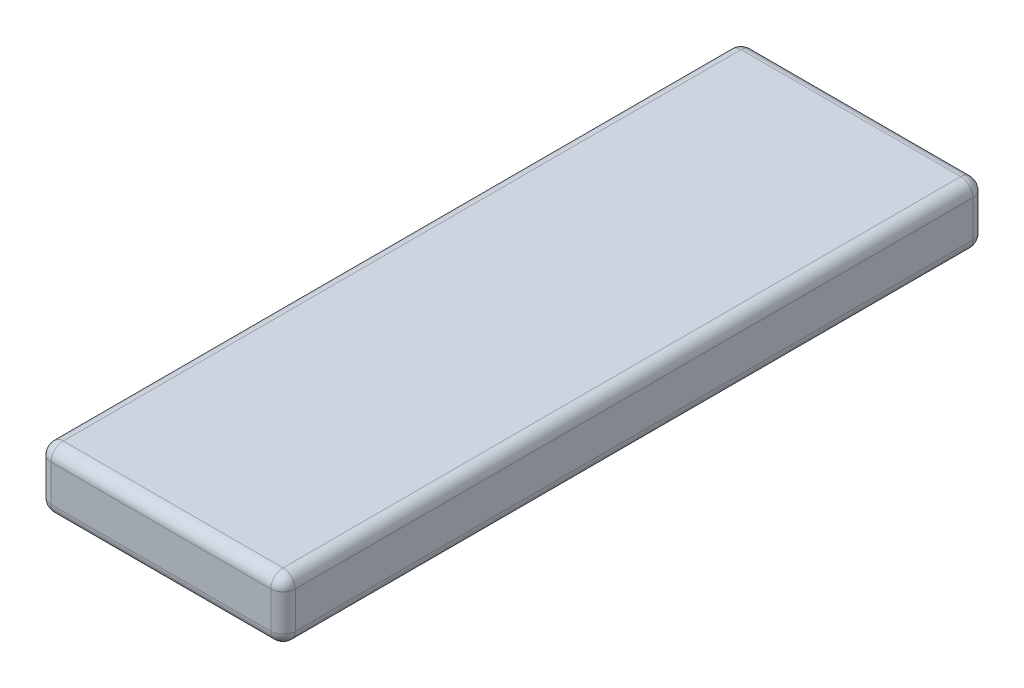
ISO-10303-21;
HEADER;
FILE_DESCRIPTION(('STEP AP214'),'2;1');
FILE_NAME('part.step','',(''),(''),'','','');
FILE_SCHEMA(('AUTOMOTIVE_DESIGN { 1 0 10303 214 1 1 1 1 }'));
ENDSEC;
DATA;
#1=APPLICATION_CONTEXT('core data for automotive mechanical design processes');
#2=APPLICATION_PROTOCOL_DEFINITION('international standard','automotive_design',2000,#1);
#3=PRODUCT_CONTEXT('',#1,'mechanical');
#4=PRODUCT('Part','Part','',(#3));
#5=PRODUCT_RELATED_PRODUCT_CATEGORY('part','',(#4));
#6=PRODUCT_DEFINITION_FORMATION('','',#4);
#7=PRODUCT_DEFINITION_CONTEXT('part definition',#1,'design');
#8=PRODUCT_DEFINITION('design','',#6,#7);
#9=PRODUCT_DEFINITION_SHAPE('','',#8);
#10=(LENGTH_UNIT() NAMED_UNIT(*) SI_UNIT(.MILLI.,.METRE.));
#11=(NAMED_UNIT(*) PLANE_ANGLE_UNIT() SI_UNIT($,.RADIAN.));
#12=(NAMED_UNIT(*) SI_UNIT($,.STERADIAN.) SOLID_ANGLE_UNIT());
#13=UNCERTAINTY_MEASURE_WITH_UNIT(LENGTH_MEASURE(1.E-05),#10,'distance_accuracy_value','');
#14=(GEOMETRIC_REPRESENTATION_CONTEXT(3) GLOBAL_UNCERTAINTY_ASSIGNED_CONTEXT((#13)) GLOBAL_UNIT_ASSIGNED_CONTEXT((#10,
#11,#12)) REPRESENTATION_CONTEXT('',''));
#15=CARTESIAN_POINT('',(0.,0.,0.));
#16=DIRECTION('',(0.,0.,1.));
#17=DIRECTION('',(1.,0.,0.));
#18=AXIS2_PLACEMENT_3D('',#15,#16,#17);
#19=CARTESIAN_POINT('',(1.8,0.199999999999996,11.3));
#20=DIRECTION('',(0.,0.258819045103027,0.965925826288933));
#21=DIRECTION('',(0.,-0.965925826288933,0.258819045103027));
#22=AXIS2_PLACEMENT_3D('',#19,#20,#21);
#23=SPHERICAL_SURFACE('',#22,0.199999999999998);
#24=CARTESIAN_POINT('',(1.8,0.2,11.3));
#25=DIRECTION('',(-1.,0.,0.));
#26=DIRECTION('',(0.,0.,1.));
#27=AXIS2_PLACEMENT_3D('',#24,#25,#26);
#28=CIRCLE('',#27,0.200000000000001);
#29=CARTESIAN_POINT('',(1.8,0.,11.3));
#30=VERTEX_POINT('',#29);
#31=CARTESIAN_POINT('',(1.8,0.2,11.5));
#32=VERTEX_POINT('',#31);
#33=EDGE_CURVE('E128',#30,#32,#28,.T.);
#34=ORIENTED_EDGE('',*,*,#33,.F.);
#35=CARTESIAN_POINT('',(1.8,0.2,11.3));
#36=DIRECTION('',(0.,0.,1.));
#37=DIRECTION('',(1.,0.,0.));
#38=AXIS2_PLACEMENT_3D('',#35,#36,#37);
#39=CIRCLE('',#38,0.2);
#40=CARTESIAN_POINT('',(2.,0.2,11.3));
#41=VERTEX_POINT('',#40);
#42=EDGE_CURVE('E21',#41,#30,#39,.F.);
#43=ORIENTED_EDGE('',*,*,#42,.F.);
#44=CARTESIAN_POINT('',(1.8,0.2,11.3));
#45=DIRECTION('',(0.,1.,0.));
#46=DIRECTION('',(0.,0.,1.));
#47=AXIS2_PLACEMENT_3D('',#44,#45,#46);
#48=CIRCLE('',#47,0.200000000000001);
#49=EDGE_CURVE('E103',#32,#41,#48,.T.);
#50=ORIENTED_EDGE('',*,*,#49,.F.);
#51=EDGE_LOOP('',(#34,#43,#50));
#52=FACE_BOUND('',#51,.T.);
#53=ADVANCED_FACE('F17',(#52),#23,.T.);
#54=CARTESIAN_POINT('',(-1.8,0.199999999999993,11.3));
#55=DIRECTION('',(0.,-0.96592582628894,-0.258819045102999));
#56=DIRECTION('',(0.,-0.258819045102999,0.96592582628894));
#57=AXIS2_PLACEMENT_3D('',#54,#55,#56);
#58=SPHERICAL_SURFACE('',#57,0.199999999999996);
#59=CARTESIAN_POINT('',(-1.8,0.2,11.3));
#60=DIRECTION('',(-1.,0.,0.));
#61=DIRECTION('',(0.,0.,1.));
#62=AXIS2_PLACEMENT_3D('',#59,#60,#61);
#63=CIRCLE('',#62,0.200000000000001);
#64=CARTESIAN_POINT('',(-1.8,0.2,11.5));
#65=VERTEX_POINT('',#64);
#66=CARTESIAN_POINT('',(-1.8,0.,11.3));
#67=VERTEX_POINT('',#66);
#68=EDGE_CURVE('E152',#65,#67,#63,.F.);
#69=ORIENTED_EDGE('',*,*,#68,.F.);
#70=CARTESIAN_POINT('',(-1.8,0.2,11.3));
#71=DIRECTION('',(0.,-1.,0.));
#72=DIRECTION('',(0.,0.,-1.));
#73=AXIS2_PLACEMENT_3D('',#70,#71,#72);
#74=CIRCLE('',#73,0.200000000000001);
#75=CARTESIAN_POINT('',(-2.,0.2,11.3));
#76=VERTEX_POINT('',#75);
#77=EDGE_CURVE('E114',#76,#65,#74,.F.);
#78=ORIENTED_EDGE('',*,*,#77,.F.);
#79=CARTESIAN_POINT('',(-1.8,0.2,11.3));
#80=DIRECTION('',(0.,0.,1.));
#81=DIRECTION('',(1.,0.,0.));
#82=AXIS2_PLACEMENT_3D('',#79,#80,#81);
#83=CIRCLE('',#82,0.2);
#84=EDGE_CURVE('E149',#67,#76,#83,.F.);
#85=ORIENTED_EDGE('',*,*,#84,.F.);
#86=EDGE_LOOP('',(#69,#78,#85));
#87=FACE_BOUND('',#86,.T.);
#88=ADVANCED_FACE('F334',(#87),#58,.T.);
#89=CARTESIAN_POINT('',(2.,0.,0.));
#90=DIRECTION('',(0.,1.,0.));
#91=DIRECTION('',(0.,0.,1.));
#92=AXIS2_PLACEMENT_3D('',#89,#90,#91);
#93=PLANE('',#92);
#94=DIRECTION('',(0.,0.,1.));
#95=VECTOR('',#94,1.);
#96=CARTESIAN_POINT('',(1.8,0.,5.75));
#97=LINE('',#96,#95);
#98=CARTESIAN_POINT('',(1.8,0.,0.2));
#99=VERTEX_POINT('',#98);
#100=EDGE_CURVE('E131',#30,#99,#97,.F.);
#101=ORIENTED_EDGE('',*,*,#100,.F.);
#102=DIRECTION('',(-1.,0.,0.));
#103=VECTOR('',#102,1.);
#104=CARTESIAN_POINT('',(0.,0.,11.3));
#105=LINE('',#104,#103);
#106=EDGE_CURVE('E115',#67,#30,#105,.F.);
#107=ORIENTED_EDGE('',*,*,#106,.F.);
#108=DIRECTION('',(0.,0.,1.));
#109=VECTOR('',#108,1.);
#110=CARTESIAN_POINT('',(-1.8,0.,5.75));
#111=LINE('',#110,#109);
#112=CARTESIAN_POINT('',(-1.8,0.,0.2));
#113=VERTEX_POINT('',#112);
#114=EDGE_CURVE('E146',#113,#67,#111,.T.);
#115=ORIENTED_EDGE('',*,*,#114,.F.);
#116=DIRECTION('',(-1.,0.,0.));
#117=VECTOR('',#116,1.);
#118=CARTESIAN_POINT('',(0.,0.,0.2));
#119=LINE('',#118,#117);
#120=EDGE_CURVE('E141',#99,#113,#119,.T.);
#121=ORIENTED_EDGE('',*,*,#120,.F.);
#122=EDGE_LOOP('',(#101,#107,#115,#121));
#123=FACE_BOUND('',#122,.T.);
#124=ADVANCED_FACE('F333',(#123),#93,.F.);
#125=CARTESIAN_POINT('',(-1.8,0.2,0.200000000000001));
#126=DIRECTION('',(-0.965925826288943,0.,0.258819045102987));
#127=DIRECTION('',(-0.258819045102987,0.,-0.965925826288943));
#128=AXIS2_PLACEMENT_3D('',#125,#126,#127);
#129=SPHERICAL_SURFACE('',#128,0.2);
#130=CARTESIAN_POINT('',(-1.8,0.2,0.2));
#131=DIRECTION('',(-1.,0.,0.));
#132=DIRECTION('',(0.,0.,1.));
#133=AXIS2_PLACEMENT_3D('',#130,#131,#132);
#134=CIRCLE('',#133,0.2);
#135=CARTESIAN_POINT('',(-1.8,0.2,0.));
#136=VERTEX_POINT('',#135);
#137=EDGE_CURVE('E144',#113,#136,#134,.F.);
#138=ORIENTED_EDGE('',*,*,#137,.F.);
#139=CARTESIAN_POINT('',(-1.8,0.2,0.2));
#140=DIRECTION('',(0.,0.,1.));
#141=DIRECTION('',(1.,0.,0.));
#142=AXIS2_PLACEMENT_3D('',#139,#140,#141);
#143=CIRCLE('',#142,0.2);
#144=CARTESIAN_POINT('',(-2.,0.2,0.2));
#145=VERTEX_POINT('',#144);
#146=EDGE_CURVE('E150',#145,#113,#143,.T.);
#147=ORIENTED_EDGE('',*,*,#146,.F.);
#148=CARTESIAN_POINT('',(-1.8,0.2,0.2));
#149=DIRECTION('',(0.,-1.,0.));
#150=DIRECTION('',(0.,0.,-1.));
#151=AXIS2_PLACEMENT_3D('',#148,#149,#150);
#152=CIRCLE('',#151,0.2);
#153=EDGE_CURVE('E181',#136,#145,#152,.F.);
#154=ORIENTED_EDGE('',*,*,#153,.F.);
#155=EDGE_LOOP('',(#138,#147,#154));
#156=FACE_BOUND('',#155,.T.);
#157=ADVANCED_FACE('F228',(#156),#129,.T.);
#158=CARTESIAN_POINT('',(1.8,0.2,0.200000000000001));
#159=DIRECTION('',(-0.258819045102989,0.,-0.965925826288943));
#160=DIRECTION('',(0.965925826288943,0.,-0.258819045102989));
#161=AXIS2_PLACEMENT_3D('',#158,#159,#160);
#162=SPHERICAL_SURFACE('',#161,0.2);
#163=CARTESIAN_POINT('',(1.8,0.2,0.2));
#164=DIRECTION('',(0.,0.,1.));
#165=DIRECTION('',(1.,0.,0.));
#166=AXIS2_PLACEMENT_3D('',#163,#164,#165);
#167=CIRCLE('',#166,0.2);
#168=CARTESIAN_POINT('',(2.,0.2,0.2));
#169=VERTEX_POINT('',#168);
#170=EDGE_CURVE('E134',#99,#169,#167,.T.);
#171=ORIENTED_EDGE('',*,*,#170,.F.);
#172=CARTESIAN_POINT('',(1.8,0.2,0.2));
#173=DIRECTION('',(-1.,0.,0.));
#174=DIRECTION('',(0.,0.,1.));
#175=AXIS2_PLACEMENT_3D('',#172,#173,#174);
#176=CIRCLE('',#175,0.2);
#177=CARTESIAN_POINT('',(1.8,0.2,0.));
#178=VERTEX_POINT('',#177);
#179=EDGE_CURVE('E145',#178,#99,#176,.T.);
#180=ORIENTED_EDGE('',*,*,#179,.F.);
#181=CARTESIAN_POINT('',(1.8,0.2,0.2));
#182=DIRECTION('',(0.,1.,0.));
#183=DIRECTION('',(0.,0.,1.));
#184=AXIS2_PLACEMENT_3D('',#181,#182,#183);
#185=CIRCLE('',#184,0.2);
#186=EDGE_CURVE('E125',#169,#178,#185,.T.);
#187=ORIENTED_EDGE('',*,*,#186,.F.);
#188=EDGE_LOOP('',(#171,#180,#187));
#189=FACE_BOUND('',#188,.T.);
#190=ADVANCED_FACE('F327',(#189),#162,.T.);
#191=CARTESIAN_POINT('',(1.8,0.2,5.75));
#192=DIRECTION('',(0.,0.,1.));
#193=DIRECTION('',(1.,0.,0.));
#194=AXIS2_PLACEMENT_3D('',#191,#192,#193);
#195=CYLINDRICAL_SURFACE('',#194,0.2);
#196=ORIENTED_EDGE('',*,*,#170,.T.);
#197=DIRECTION('',(0.,0.,-1.));
#198=VECTOR('',#197,1.);
#199=CARTESIAN_POINT('',(2.,0.2,0.));
#200=LINE('',#199,#198);
#201=EDGE_CURVE('E121',#41,#169,#200,.T.);
#202=ORIENTED_EDGE('',*,*,#201,.F.);
#203=ORIENTED_EDGE('',*,*,#42,.T.);
#204=ORIENTED_EDGE('',*,*,#100,.T.);
#205=EDGE_LOOP('',(#196,#202,#203,#204));
#206=FACE_BOUND('',#205,.T.);
#207=ADVANCED_FACE('F132',(#206),#195,.T.);
#208=CARTESIAN_POINT('',(0.,0.2,11.3));
#209=DIRECTION('',(-1.,0.,0.));
#210=DIRECTION('',(0.,0.,1.));
#211=AXIS2_PLACEMENT_3D('',#208,#209,#210);
#212=CYLINDRICAL_SURFACE('',#211,0.200000000000001);
#213=ORIENTED_EDGE('',*,*,#68,.T.);
#214=ORIENTED_EDGE('',*,*,#106,.T.);
#215=ORIENTED_EDGE('',*,*,#33,.T.);
#216=DIRECTION('',(1.,0.,0.));
#217=VECTOR('',#216,1.);
#218=CARTESIAN_POINT('',(0.,0.2,11.5));
#219=LINE('',#218,#217);
#220=EDGE_CURVE('E177',#65,#32,#219,.T.);
#221=ORIENTED_EDGE('',*,*,#220,.F.);
#222=EDGE_LOOP('',(#213,#214,#215,#221));
#223=FACE_BOUND('',#222,.T.);
#224=ADVANCED_FACE('F345',(#223),#212,.T.);
#225=CARTESIAN_POINT('',(1.8,0.5,11.3));
#226=DIRECTION('',(0.,1.,0.));
#227=DIRECTION('',(0.,0.,1.));
#228=AXIS2_PLACEMENT_3D('',#225,#226,#227);
#229=CYLINDRICAL_SURFACE('',#228,0.200000000000001);
#230=ORIENTED_EDGE('',*,*,#49,.T.);
#231=DIRECTION('',(0.,1.,0.));
#232=VECTOR('',#231,1.);
#233=CARTESIAN_POINT('',(2.,0.,11.3));
#234=LINE('',#233,#232);
#235=CARTESIAN_POINT('',(2.,0.8,11.3));
#236=VERTEX_POINT('',#235);
#237=EDGE_CURVE('E107',#236,#41,#234,.F.);
#238=ORIENTED_EDGE('',*,*,#237,.F.);
#239=CARTESIAN_POINT('',(1.8,0.8,11.3));
#240=DIRECTION('',(0.,1.,0.));
#241=DIRECTION('',(0.,0.,1.));
#242=AXIS2_PLACEMENT_3D('',#239,#240,#241);
#243=CIRCLE('',#242,0.200000000000001);
#244=CARTESIAN_POINT('',(1.8,0.8,11.5));
#245=VERTEX_POINT('',#244);
#246=EDGE_CURVE('E175',#245,#236,#243,.T.);
#247=ORIENTED_EDGE('',*,*,#246,.F.);
#248=DIRECTION('',(0.,1.,0.));
#249=VECTOR('',#248,1.);
#250=CARTESIAN_POINT('',(1.8,0.,11.5));
#251=LINE('',#250,#249);
#252=EDGE_CURVE('E109',#32,#245,#251,.T.);
#253=ORIENTED_EDGE('',*,*,#252,.F.);
#254=EDGE_LOOP('',(#230,#238,#247,#253));
#255=FACE_BOUND('',#254,.T.);
#256=ADVANCED_FACE('F105',(#255),#229,.T.);
#257=CARTESIAN_POINT('',(-1.8,0.5,11.3));
#258=DIRECTION('',(0.,-1.,0.));
#259=DIRECTION('',(0.,0.,-1.));
#260=AXIS2_PLACEMENT_3D('',#257,#258,#259);
#261=CYLINDRICAL_SURFACE('',#260,0.200000000000001);
#262=CARTESIAN_POINT('',(-1.8,0.8,11.3));
#263=DIRECTION('',(0.,-1.,0.));
#264=DIRECTION('',(0.,0.,-1.));
#265=AXIS2_PLACEMENT_3D('',#262,#263,#264);
#266=CIRCLE('',#265,0.200000000000001);
#267=CARTESIAN_POINT('',(-2.,0.8,11.3));
#268=VERTEX_POINT('',#267);
#269=CARTESIAN_POINT('',(-1.8,0.8,11.5));
#270=VERTEX_POINT('',#269);
#271=EDGE_CURVE('E172',#268,#270,#266,.F.);
#272=ORIENTED_EDGE('',*,*,#271,.F.);
#273=DIRECTION('',(0.,1.,0.));
#274=VECTOR('',#273,1.);
#275=CARTESIAN_POINT('',(-2.,1.,11.3));
#276=LINE('',#275,#274);
#277=EDGE_CURVE('E174',#76,#268,#276,.T.);
#278=ORIENTED_EDGE('',*,*,#277,.F.);
#279=ORIENTED_EDGE('',*,*,#77,.T.);
#280=DIRECTION('',(0.,1.,0.));
#281=VECTOR('',#280,1.);
#282=CARTESIAN_POINT('',(-1.8,0.,11.5));
#283=LINE('',#282,#281);
#284=EDGE_CURVE('E192',#270,#65,#283,.F.);
#285=ORIENTED_EDGE('',*,*,#284,.F.);
#286=EDGE_LOOP('',(#272,#278,#279,#285));
#287=FACE_BOUND('',#286,.T.);
#288=ADVANCED_FACE('F292',(#287),#261,.T.);
#289=CARTESIAN_POINT('',(-1.8,0.2,5.75));
#290=DIRECTION('',(0.,0.,1.));
#291=DIRECTION('',(1.,0.,0.));
#292=AXIS2_PLACEMENT_3D('',#289,#290,#291);
#293=CYLINDRICAL_SURFACE('',#292,0.2);
#294=ORIENTED_EDGE('',*,*,#84,.T.);
#295=DIRECTION('',(0.,0.,1.));
#296=VECTOR('',#295,1.);
#297=CARTESIAN_POINT('',(-2.,0.2,0.));
#298=LINE('',#297,#296);
#299=EDGE_CURVE('E190',#145,#76,#298,.T.);
#300=ORIENTED_EDGE('',*,*,#299,.F.);
#301=ORIENTED_EDGE('',*,*,#146,.T.);
#302=ORIENTED_EDGE('',*,*,#114,.T.);
#303=EDGE_LOOP('',(#294,#300,#301,#302));
#304=FACE_BOUND('',#303,.T.);
#305=ADVANCED_FACE('F230',(#304),#293,.T.);
#306=CARTESIAN_POINT('',(-1.8,0.5,0.2));
#307=DIRECTION('',(0.,-1.,0.));
#308=DIRECTION('',(0.,0.,-1.));
#309=AXIS2_PLACEMENT_3D('',#306,#307,#308);
#310=CYLINDRICAL_SURFACE('',#309,0.2);
#311=CARTESIAN_POINT('',(-1.8,0.8,0.200000000000001));
#312=DIRECTION('',(0.,1.,0.));
#313=DIRECTION('',(0.,0.,1.));
#314=AXIS2_PLACEMENT_3D('',#311,#312,#313);
#315=CIRCLE('',#314,0.2);
#316=CARTESIAN_POINT('',(-1.8,0.8,0.));
#317=VERTEX_POINT('',#316);
#318=CARTESIAN_POINT('',(-2.,0.8,0.2));
#319=VERTEX_POINT('',#318);
#320=EDGE_CURVE('E232',#317,#319,#315,.T.);
#321=ORIENTED_EDGE('',*,*,#320,.F.);
#322=DIRECTION('',(0.,1.,0.));
#323=VECTOR('',#322,1.);
#324=CARTESIAN_POINT('',(-1.8,0.,0.));
#325=LINE('',#324,#323);
#326=EDGE_CURVE('E206',#317,#136,#325,.F.);
#327=ORIENTED_EDGE('',*,*,#326,.T.);
#328=ORIENTED_EDGE('',*,*,#153,.T.);
#329=DIRECTION('',(0.,1.,0.));
#330=VECTOR('',#329,1.);
#331=CARTESIAN_POINT('',(-2.,1.,0.2));
#332=LINE('',#331,#330);
#333=EDGE_CURVE('E214',#319,#145,#332,.F.);
#334=ORIENTED_EDGE('',*,*,#333,.F.);
#335=EDGE_LOOP('',(#321,#327,#328,#334));
#336=FACE_BOUND('',#335,.T.);
#337=ADVANCED_FACE('F213',(#336),#310,.T.);
#338=CARTESIAN_POINT('',(0.,0.2,0.2));
#339=DIRECTION('',(-1.,0.,0.));
#340=DIRECTION('',(0.,0.,1.));
#341=AXIS2_PLACEMENT_3D('',#338,#339,#340);
#342=CYLINDRICAL_SURFACE('',#341,0.2);
#343=ORIENTED_EDGE('',*,*,#137,.T.);
#344=DIRECTION('',(1.,0.,0.));
#345=VECTOR('',#344,1.);
#346=CARTESIAN_POINT('',(0.,0.2,0.));
#347=LINE('',#346,#345);
#348=EDGE_CURVE('E204',#136,#178,#347,.T.);
#349=ORIENTED_EDGE('',*,*,#348,.T.);
#350=ORIENTED_EDGE('',*,*,#179,.T.);
#351=ORIENTED_EDGE('',*,*,#120,.T.);
#352=EDGE_LOOP('',(#343,#349,#350,#351));
#353=FACE_BOUND('',#352,.T.);
#354=ADVANCED_FACE('F356',(#353),#342,.T.);
#355=CARTESIAN_POINT('',(1.8,0.5,0.2));
#356=DIRECTION('',(0.,1.,0.));
#357=DIRECTION('',(0.,0.,1.));
#358=AXIS2_PLACEMENT_3D('',#355,#356,#357);
#359=CYLINDRICAL_SURFACE('',#358,0.2);
#360=ORIENTED_EDGE('',*,*,#186,.T.);
#361=DIRECTION('',(0.,1.,0.));
#362=VECTOR('',#361,1.);
#363=CARTESIAN_POINT('',(1.8,0.,0.));
#364=LINE('',#363,#362);
#365=CARTESIAN_POINT('',(1.8,0.8,0.));
#366=VERTEX_POINT('',#365);
#367=EDGE_CURVE('E171',#178,#366,#364,.T.);
#368=ORIENTED_EDGE('',*,*,#367,.T.);
#369=CARTESIAN_POINT('',(1.8,0.8,0.200000000000001));
#370=DIRECTION('',(0.,1.,0.));
#371=DIRECTION('',(0.,0.,1.));
#372=AXIS2_PLACEMENT_3D('',#369,#370,#371);
#373=CIRCLE('',#372,0.2);
#374=CARTESIAN_POINT('',(2.,0.8,0.2));
#375=VERTEX_POINT('',#374);
#376=EDGE_CURVE('E233',#375,#366,#373,.T.);
#377=ORIENTED_EDGE('',*,*,#376,.F.);
#378=DIRECTION('',(0.,1.,0.));
#379=VECTOR('',#378,1.);
#380=CARTESIAN_POINT('',(2.,0.,0.2));
#381=LINE('',#380,#379);
#382=EDGE_CURVE('E135',#169,#375,#381,.T.);
#383=ORIENTED_EDGE('',*,*,#382,.F.);
#384=EDGE_LOOP('',(#360,#368,#377,#383));
#385=FACE_BOUND('',#384,.T.);
#386=ADVANCED_FACE('F277',(#385),#359,.T.);
#387=CARTESIAN_POINT('',(2.,0.,0.));
#388=DIRECTION('',(1.,0.,0.));
#389=DIRECTION('',(0.,0.,-1.));
#390=AXIS2_PLACEMENT_3D('',#387,#388,#389);
#391=PLANE('',#390);
#392=ORIENTED_EDGE('',*,*,#382,.T.);
#393=DIRECTION('',(0.,0.,1.));
#394=VECTOR('',#393,1.);
#395=CARTESIAN_POINT('',(2.,0.8,5.75));
#396=LINE('',#395,#394);
#397=EDGE_CURVE('E124',#236,#375,#396,.F.);
#398=ORIENTED_EDGE('',*,*,#397,.F.);
#399=ORIENTED_EDGE('',*,*,#237,.T.);
#400=ORIENTED_EDGE('',*,*,#201,.T.);
#401=EDGE_LOOP('',(#392,#398,#399,#400));
#402=FACE_BOUND('',#401,.T.);
#403=ADVANCED_FACE('F119',(#402),#391,.T.);
#404=CARTESIAN_POINT('',(0.,0.,11.5));
#405=DIRECTION('',(0.,0.,1.));
#406=DIRECTION('',(1.,0.,0.));
#407=AXIS2_PLACEMENT_3D('',#404,#405,#406);
#408=PLANE('',#407);
#409=ORIENTED_EDGE('',*,*,#284,.T.);
#410=ORIENTED_EDGE('',*,*,#220,.T.);
#411=ORIENTED_EDGE('',*,*,#252,.T.);
#412=DIRECTION('',(1.,0.,0.));
#413=VECTOR('',#412,1.);
#414=CARTESIAN_POINT('',(0.,0.8,11.5));
#415=LINE('',#414,#413);
#416=EDGE_CURVE('E249',#270,#245,#415,.T.);
#417=ORIENTED_EDGE('',*,*,#416,.F.);
#418=EDGE_LOOP('',(#409,#410,#411,#417));
#419=FACE_BOUND('',#418,.T.);
#420=ADVANCED_FACE('F293',(#419),#408,.T.);
#421=CARTESIAN_POINT('',(1.8,0.800000000000001,11.3));
#422=DIRECTION('',(0.,0.965925826288947,-0.258819045102975));
#423=DIRECTION('',(0.,0.258819045102975,0.965925826288947));
#424=AXIS2_PLACEMENT_3D('',#421,#422,#423);
#425=SPHERICAL_SURFACE('',#424,0.199999999999999);
#426=CARTESIAN_POINT('',(1.8,0.8,11.3));
#427=DIRECTION('',(1.,0.,0.));
#428=DIRECTION('',(0.,0.,-1.));
#429=AXIS2_PLACEMENT_3D('',#426,#427,#428);
#430=CIRCLE('',#429,0.200000000000001);
#431=CARTESIAN_POINT('',(1.8,1.,11.3));
#432=VERTEX_POINT('',#431);
#433=EDGE_CURVE('E165',#245,#432,#430,.F.);
#434=ORIENTED_EDGE('',*,*,#433,.F.);
#435=ORIENTED_EDGE('',*,*,#246,.T.);
#436=CARTESIAN_POINT('',(1.8,0.8,11.3));
#437=DIRECTION('',(0.,0.,1.));
#438=DIRECTION('',(1.,0.,0.));
#439=AXIS2_PLACEMENT_3D('',#436,#437,#438);
#440=CIRCLE('',#439,0.2);
#441=EDGE_CURVE('E166',#432,#236,#440,.F.);
#442=ORIENTED_EDGE('',*,*,#441,.F.);
#443=EDGE_LOOP('',(#434,#435,#442));
#444=FACE_BOUND('',#443,.T.);
#445=ADVANCED_FACE('F260',(#444),#425,.T.);
#446=CARTESIAN_POINT('',(-1.8,0.800000000000004,11.3));
#447=DIRECTION('',(0.,-0.258819045103031,0.965925826288932));
#448=DIRECTION('',(0.,0.965925826288932,0.258819045103031));
#449=AXIS2_PLACEMENT_3D('',#446,#447,#448);
#450=SPHERICAL_SURFACE('',#449,0.199999999999997);
#451=CARTESIAN_POINT('',(-1.8,0.8,11.3));
#452=DIRECTION('',(1.,0.,0.));
#453=DIRECTION('',(0.,0.,-1.));
#454=AXIS2_PLACEMENT_3D('',#451,#452,#453);
#455=CIRCLE('',#454,0.200000000000001);
#456=CARTESIAN_POINT('',(-1.8,1.,11.3));
#457=VERTEX_POINT('',#456);
#458=EDGE_CURVE('E201',#457,#270,#455,.T.);
#459=ORIENTED_EDGE('',*,*,#458,.F.);
#460=CARTESIAN_POINT('',(-1.8,0.8,11.3));
#461=DIRECTION('',(0.,0.,1.));
#462=DIRECTION('',(1.,0.,0.));
#463=AXIS2_PLACEMENT_3D('',#460,#461,#462);
#464=CIRCLE('',#463,0.2);
#465=EDGE_CURVE('E163',#268,#457,#464,.F.);
#466=ORIENTED_EDGE('',*,*,#465,.F.);
#467=ORIENTED_EDGE('',*,*,#271,.T.);
#468=EDGE_LOOP('',(#459,#466,#467));
#469=FACE_BOUND('',#468,.T.);
#470=ADVANCED_FACE('F289',(#469),#450,.T.);
#471=CARTESIAN_POINT('',(-2.,1.,0.));
#472=DIRECTION('',(-1.,0.,0.));
#473=DIRECTION('',(0.,0.,1.));
#474=AXIS2_PLACEMENT_3D('',#471,#472,#473);
#475=PLANE('',#474);
#476=ORIENTED_EDGE('',*,*,#333,.T.);
#477=ORIENTED_EDGE('',*,*,#299,.T.);
#478=ORIENTED_EDGE('',*,*,#277,.T.);
#479=DIRECTION('',(0.,0.,1.));
#480=VECTOR('',#479,1.);
#481=CARTESIAN_POINT('',(-2.,0.8,5.75));
#482=LINE('',#481,#480);
#483=EDGE_CURVE('E159',#319,#268,#482,.T.);
#484=ORIENTED_EDGE('',*,*,#483,.F.);
#485=EDGE_LOOP('',(#476,#477,#478,#484));
#486=FACE_BOUND('',#485,.T.);
#487=ADVANCED_FACE('F223',(#486),#475,.T.);
#488=CARTESIAN_POINT('',(-1.8,0.8,0.200000000000001));
#489=DIRECTION('',(0.258819045102988,0.,-0.965925826288943));
#490=DIRECTION('',(-0.965925826288943,0.,-0.258819045102988));
#491=AXIS2_PLACEMENT_3D('',#488,#489,#490);
#492=SPHERICAL_SURFACE('',#491,0.2);
#493=CARTESIAN_POINT('',(-1.8,0.8,0.2));
#494=DIRECTION('',(0.,0.,1.));
#495=DIRECTION('',(1.,0.,0.));
#496=AXIS2_PLACEMENT_3D('',#493,#494,#495);
#497=CIRCLE('',#496,0.2);
#498=CARTESIAN_POINT('',(-1.8,1.,0.2));
#499=VERTEX_POINT('',#498);
#500=EDGE_CURVE('E160',#499,#319,#497,.T.);
#501=ORIENTED_EDGE('',*,*,#500,.F.);
#502=CARTESIAN_POINT('',(-1.8,0.8,0.2));
#503=DIRECTION('',(1.,0.,0.));
#504=DIRECTION('',(0.,0.,-1.));
#505=AXIS2_PLACEMENT_3D('',#502,#503,#504);
#506=CIRCLE('',#505,0.2);
#507=EDGE_CURVE('E35',#317,#499,#506,.T.);
#508=ORIENTED_EDGE('',*,*,#507,.F.);
#509=ORIENTED_EDGE('',*,*,#320,.T.);
#510=EDGE_LOOP('',(#501,#508,#509));
#511=FACE_BOUND('',#510,.T.);
#512=ADVANCED_FACE('F283',(#511),#492,.T.);
#513=CARTESIAN_POINT('',(1.8,0.8,0.200000000000001));
#514=DIRECTION('',(0.965925826288943,0.,0.258819045102988));
#515=DIRECTION('',(0.258819045102988,0.,-0.965925826288943));
#516=AXIS2_PLACEMENT_3D('',#513,#514,#515);
#517=SPHERICAL_SURFACE('',#516,0.2);
#518=CARTESIAN_POINT('',(1.8,0.8,0.2));
#519=DIRECTION('',(1.,0.,0.));
#520=DIRECTION('',(0.,0.,-1.));
#521=AXIS2_PLACEMENT_3D('',#518,#519,#520);
#522=CIRCLE('',#521,0.2);
#523=CARTESIAN_POINT('',(1.8,1.,0.2));
#524=VERTEX_POINT('',#523);
#525=EDGE_CURVE('E154',#524,#366,#522,.F.);
#526=ORIENTED_EDGE('',*,*,#525,.F.);
#527=CARTESIAN_POINT('',(1.8,0.8,0.2));
#528=DIRECTION('',(0.,0.,1.));
#529=DIRECTION('',(1.,0.,0.));
#530=AXIS2_PLACEMENT_3D('',#527,#528,#529);
#531=CIRCLE('',#530,0.2);
#532=EDGE_CURVE('E169',#375,#524,#531,.T.);
#533=ORIENTED_EDGE('',*,*,#532,.F.);
#534=ORIENTED_EDGE('',*,*,#376,.T.);
#535=EDGE_LOOP('',(#526,#533,#534));
#536=FACE_BOUND('',#535,.T.);
#537=ADVANCED_FACE('F19',(#536),#517,.T.);
#538=CARTESIAN_POINT('',(0.,0.,0.));
#539=DIRECTION('',(0.,0.,1.));
#540=DIRECTION('',(1.,0.,0.));
#541=AXIS2_PLACEMENT_3D('',#538,#539,#540);
#542=PLANE('',#541);
#543=ORIENTED_EDGE('',*,*,#367,.F.);
#544=ORIENTED_EDGE('',*,*,#348,.F.);
#545=ORIENTED_EDGE('',*,*,#326,.F.);
#546=DIRECTION('',(1.,0.,0.));
#547=VECTOR('',#546,1.);
#548=CARTESIAN_POINT('',(0.,0.8,0.));
#549=LINE('',#548,#547);
#550=EDGE_CURVE('E157',#366,#317,#549,.F.);
#551=ORIENTED_EDGE('',*,*,#550,.F.);
#552=EDGE_LOOP('',(#543,#544,#545,#551));
#553=FACE_BOUND('',#552,.T.);
#554=ADVANCED_FACE('F281',(#553),#542,.F.);
#555=CARTESIAN_POINT('',(1.8,0.8,5.75));
#556=DIRECTION('',(0.,0.,1.));
#557=DIRECTION('',(1.,0.,0.));
#558=AXIS2_PLACEMENT_3D('',#555,#556,#557);
#559=CYLINDRICAL_SURFACE('',#558,0.2);
#560=ORIENTED_EDGE('',*,*,#441,.T.);
#561=ORIENTED_EDGE('',*,*,#397,.T.);
#562=ORIENTED_EDGE('',*,*,#532,.T.);
#563=DIRECTION('',(0.,0.,-1.));
#564=VECTOR('',#563,1.);
#565=CARTESIAN_POINT('',(1.8,1.,0.));
#566=LINE('',#565,#564);
#567=EDGE_CURVE('E252',#524,#432,#566,.F.);
#568=ORIENTED_EDGE('',*,*,#567,.T.);
#569=EDGE_LOOP('',(#560,#561,#562,#568));
#570=FACE_BOUND('',#569,.T.);
#571=ADVANCED_FACE('F269',(#570),#559,.T.);
#572=CARTESIAN_POINT('',(0.,0.8,11.3));
#573=DIRECTION('',(1.,0.,0.));
#574=DIRECTION('',(0.,0.,-1.));
#575=AXIS2_PLACEMENT_3D('',#572,#573,#574);
#576=CYLINDRICAL_SURFACE('',#575,0.200000000000001);
#577=ORIENTED_EDGE('',*,*,#433,.T.);
#578=DIRECTION('',(1.,0.,0.));
#579=VECTOR('',#578,1.);
#580=CARTESIAN_POINT('',(-2.,1.,11.3));
#581=LINE('',#580,#579);
#582=EDGE_CURVE('E243',#432,#457,#581,.F.);
#583=ORIENTED_EDGE('',*,*,#582,.T.);
#584=ORIENTED_EDGE('',*,*,#458,.T.);
#585=ORIENTED_EDGE('',*,*,#416,.T.);
#586=EDGE_LOOP('',(#577,#583,#584,#585));
#587=FACE_BOUND('',#586,.T.);
#588=ADVANCED_FACE('F257',(#587),#576,.T.);
#589=CARTESIAN_POINT('',(-1.8,0.8,5.75));
#590=DIRECTION('',(0.,0.,1.));
#591=DIRECTION('',(1.,0.,0.));
#592=AXIS2_PLACEMENT_3D('',#589,#590,#591);
#593=CYLINDRICAL_SURFACE('',#592,0.2);
#594=ORIENTED_EDGE('',*,*,#500,.T.);
#595=ORIENTED_EDGE('',*,*,#483,.T.);
#596=ORIENTED_EDGE('',*,*,#465,.T.);
#597=DIRECTION('',(0.,0.,-1.));
#598=VECTOR('',#597,1.);
#599=CARTESIAN_POINT('',(-1.8,1.,0.));
#600=LINE('',#599,#598);
#601=EDGE_CURVE('E27',#457,#499,#600,.T.);
#602=ORIENTED_EDGE('',*,*,#601,.T.);
#603=EDGE_LOOP('',(#594,#595,#596,#602));
#604=FACE_BOUND('',#603,.T.);
#605=ADVANCED_FACE('F285',(#604),#593,.T.);
#606=CARTESIAN_POINT('',(0.,0.8,0.2));
#607=DIRECTION('',(1.,0.,0.));
#608=DIRECTION('',(0.,0.,-1.));
#609=AXIS2_PLACEMENT_3D('',#606,#607,#608);
#610=CYLINDRICAL_SURFACE('',#609,0.2);
#611=ORIENTED_EDGE('',*,*,#525,.T.);
#612=ORIENTED_EDGE('',*,*,#550,.T.);
#613=ORIENTED_EDGE('',*,*,#507,.T.);
#614=DIRECTION('',(1.,0.,0.));
#615=VECTOR('',#614,1.);
#616=CARTESIAN_POINT('',(-2.,1.,0.2));
#617=LINE('',#616,#615);
#618=EDGE_CURVE('E11',#499,#524,#617,.T.);
#619=ORIENTED_EDGE('',*,*,#618,.T.);
#620=EDGE_LOOP('',(#611,#612,#613,#619));
#621=FACE_BOUND('',#620,.T.);
#622=ADVANCED_FACE('F282',(#621),#610,.T.);
#623=CARTESIAN_POINT('',(-2.,1.,0.));
#624=DIRECTION('',(0.,-1.,0.));
#625=DIRECTION('',(0.,0.,-1.));
#626=AXIS2_PLACEMENT_3D('',#623,#624,#625);
#627=PLANE('',#626);
#628=ORIENTED_EDGE('',*,*,#601,.F.);
#629=ORIENTED_EDGE('',*,*,#582,.F.);
#630=ORIENTED_EDGE('',*,*,#567,.F.);
#631=ORIENTED_EDGE('',*,*,#618,.F.);
#632=EDGE_LOOP('',(#628,#629,#630,#631));
#633=FACE_BOUND('',#632,.T.);
#634=ADVANCED_FACE('F266',(#633),#627,.F.);
#635=CLOSED_SHELL('',(#53,#88,#124,#157,#190,#207,#224,#256,#288,#305,#337,#354,#386,#403,#420,
#445,#470,#487,#512,#537,#554,#571,#588,#605,#622,#634));
#636=MANIFOLD_SOLID_BREP('B1',#635);
#637=ADVANCED_BREP_SHAPE_REPRESENTATION('',(#18,#636),#14);
#638=SHAPE_DEFINITION_REPRESENTATION(#9,#637);
ENDSEC;
END-ISO-10303-21;
